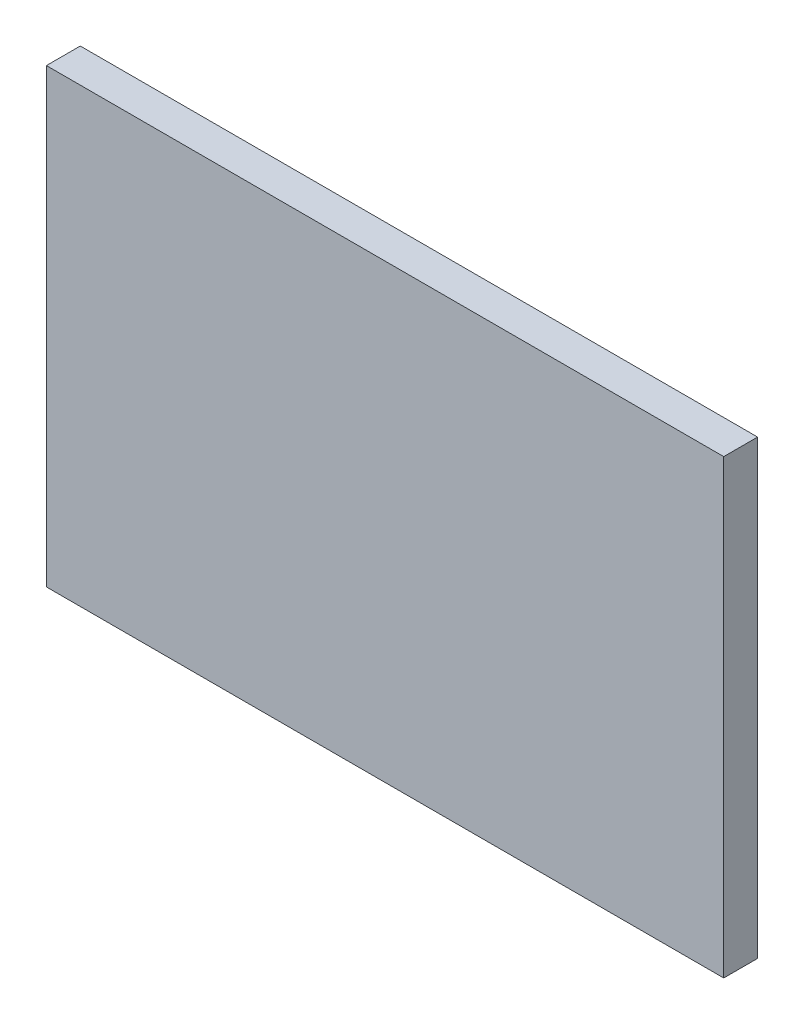
ISO-10303-21;
HEADER;
FILE_DESCRIPTION(('STEP AP214'),'2;1');
FILE_NAME('part.step','',(''),(''),'','','');
FILE_SCHEMA(('AUTOMOTIVE_DESIGN { 1 0 10303 214 1 1 1 1 }'));
ENDSEC;
DATA;
#1=APPLICATION_CONTEXT('core data for automotive mechanical design processes');
#2=APPLICATION_PROTOCOL_DEFINITION('international standard','automotive_design',2000,#1);
#3=PRODUCT_CONTEXT('',#1,'mechanical');
#4=PRODUCT('Part','Part','',(#3));
#5=PRODUCT_RELATED_PRODUCT_CATEGORY('part','',(#4));
#6=PRODUCT_DEFINITION_FORMATION('','',#4);
#7=PRODUCT_DEFINITION_CONTEXT('part definition',#1,'design');
#8=PRODUCT_DEFINITION('design','',#6,#7);
#9=PRODUCT_DEFINITION_SHAPE('','',#8);
#10=(LENGTH_UNIT() NAMED_UNIT(*) SI_UNIT(.MILLI.,.METRE.));
#11=(NAMED_UNIT(*) PLANE_ANGLE_UNIT() SI_UNIT($,.RADIAN.));
#12=(NAMED_UNIT(*) SI_UNIT($,.STERADIAN.) SOLID_ANGLE_UNIT());
#13=UNCERTAINTY_MEASURE_WITH_UNIT(LENGTH_MEASURE(1.E-05),#10,'distance_accuracy_value','');
#14=(GEOMETRIC_REPRESENTATION_CONTEXT(3) GLOBAL_UNCERTAINTY_ASSIGNED_CONTEXT((#13)) GLOBAL_UNIT_ASSIGNED_CONTEXT((#10,
#11,#12)) REPRESENTATION_CONTEXT('',''));
#15=CARTESIAN_POINT('',(0.,0.,0.));
#16=DIRECTION('',(0.,0.,1.));
#17=DIRECTION('',(1.,0.,0.));
#18=AXIS2_PLACEMENT_3D('',#15,#16,#17);
#19=CARTESIAN_POINT('',(-30.,40.,1.5));
#20=DIRECTION('',(1.,0.,0.));
#21=DIRECTION('',(0.,0.,-1.));
#22=AXIS2_PLACEMENT_3D('',#19,#20,#21);
#23=PLANE('',#22);
#24=DIRECTION('',(0.,0.,1.));
#25=VECTOR('',#24,1.);
#26=CARTESIAN_POINT('',(-30.,0.,1.5));
#27=LINE('',#26,#25);
#28=CARTESIAN_POINT('',(-30.,0.,-1.5));
#29=VERTEX_POINT('',#28);
#30=CARTESIAN_POINT('',(-30.,0.,1.5));
#31=VERTEX_POINT('',#30);
#32=EDGE_CURVE('E96',#29,#31,#27,.T.);
#33=ORIENTED_EDGE('',*,*,#32,.T.);
#34=DIRECTION('',(0.,-1.,0.));
#35=VECTOR('',#34,1.);
#36=CARTESIAN_POINT('',(-30.,40.,1.5));
#37=LINE('',#36,#35);
#38=CARTESIAN_POINT('',(-30.,40.,1.5));
#39=VERTEX_POINT('',#38);
#40=EDGE_CURVE('E11',#39,#31,#37,.T.);
#41=ORIENTED_EDGE('',*,*,#40,.F.);
#42=DIRECTION('',(0.,0.,1.));
#43=VECTOR('',#42,1.);
#44=CARTESIAN_POINT('',(-30.,40.,1.5));
#45=LINE('',#44,#43);
#46=CARTESIAN_POINT('',(-30.,40.,-1.5));
#47=VERTEX_POINT('',#46);
#48=EDGE_CURVE('E84',#47,#39,#45,.T.);
#49=ORIENTED_EDGE('',*,*,#48,.F.);
#50=DIRECTION('',(0.,-1.,0.));
#51=VECTOR('',#50,1.);
#52=CARTESIAN_POINT('',(-30.,40.,-1.5));
#53=LINE('',#52,#51);
#54=EDGE_CURVE('E92',#47,#29,#53,.T.);
#55=ORIENTED_EDGE('',*,*,#54,.T.);
#56=EDGE_LOOP('',(#33,#41,#49,#55));
#57=FACE_BOUND('',#56,.T.);
#58=ADVANCED_FACE('F33',(#57),#23,.F.);
#59=CARTESIAN_POINT('',(30.,40.,1.5));
#60=DIRECTION('',(0.,0.,-1.));
#61=DIRECTION('',(-1.,0.,0.));
#62=AXIS2_PLACEMENT_3D('',#59,#60,#61);
#63=PLANE('',#62);
#64=DIRECTION('',(1.,0.,0.));
#65=VECTOR('',#64,1.);
#66=CARTESIAN_POINT('',(30.,0.,1.5));
#67=LINE('',#66,#65);
#68=CARTESIAN_POINT('',(30.,0.,1.5));
#69=VERTEX_POINT('',#68);
#70=EDGE_CURVE('E88',#31,#69,#67,.T.);
#71=ORIENTED_EDGE('',*,*,#70,.T.);
#72=DIRECTION('',(0.,-1.,0.));
#73=VECTOR('',#72,1.);
#74=CARTESIAN_POINT('',(30.,40.,1.5));
#75=LINE('',#74,#73);
#76=CARTESIAN_POINT('',(30.,40.,1.5));
#77=VERTEX_POINT('',#76);
#78=EDGE_CURVE('E41',#77,#69,#75,.T.);
#79=ORIENTED_EDGE('',*,*,#78,.F.);
#80=DIRECTION('',(1.,0.,0.));
#81=VECTOR('',#80,1.);
#82=CARTESIAN_POINT('',(30.,40.,1.5));
#83=LINE('',#82,#81);
#84=EDGE_CURVE('E79',#39,#77,#83,.T.);
#85=ORIENTED_EDGE('',*,*,#84,.F.);
#86=ORIENTED_EDGE('',*,*,#40,.T.);
#87=EDGE_LOOP('',(#71,#79,#85,#86));
#88=FACE_BOUND('',#87,.T.);
#89=ADVANCED_FACE('F87',(#88),#63,.F.);
#90=CARTESIAN_POINT('',(30.,40.,1.5));
#91=DIRECTION('',(-1.,0.,0.));
#92=DIRECTION('',(0.,0.,1.));
#93=AXIS2_PLACEMENT_3D('',#90,#91,#92);
#94=PLANE('',#93);
#95=DIRECTION('',(0.,0.,-1.));
#96=VECTOR('',#95,1.);
#97=CARTESIAN_POINT('',(30.,0.,1.5));
#98=LINE('',#97,#96);
#99=CARTESIAN_POINT('',(30.,0.,-1.5));
#100=VERTEX_POINT('',#99);
#101=EDGE_CURVE('E66',#69,#100,#98,.T.);
#102=ORIENTED_EDGE('',*,*,#101,.T.);
#103=DIRECTION('',(0.,-1.,0.));
#104=VECTOR('',#103,1.);
#105=CARTESIAN_POINT('',(30.,40.,-1.5));
#106=LINE('',#105,#104);
#107=CARTESIAN_POINT('',(30.,40.,-1.5));
#108=VERTEX_POINT('',#107);
#109=EDGE_CURVE('E89',#108,#100,#106,.T.);
#110=ORIENTED_EDGE('',*,*,#109,.F.);
#111=DIRECTION('',(0.,0.,-1.));
#112=VECTOR('',#111,1.);
#113=CARTESIAN_POINT('',(30.,40.,1.5));
#114=LINE('',#113,#112);
#115=EDGE_CURVE('E82',#77,#108,#114,.T.);
#116=ORIENTED_EDGE('',*,*,#115,.F.);
#117=ORIENTED_EDGE('',*,*,#78,.T.);
#118=EDGE_LOOP('',(#102,#110,#116,#117));
#119=FACE_BOUND('',#118,.T.);
#120=ADVANCED_FACE('F90',(#119),#94,.F.);
#121=CARTESIAN_POINT('',(30.,40.,-1.5));
#122=DIRECTION('',(0.,0.,1.));
#123=DIRECTION('',(1.,0.,0.));
#124=AXIS2_PLACEMENT_3D('',#121,#122,#123);
#125=PLANE('',#124);
#126=DIRECTION('',(-1.,0.,0.));
#127=VECTOR('',#126,1.);
#128=CARTESIAN_POINT('',(30.,0.,-1.5));
#129=LINE('',#128,#127);
#130=EDGE_CURVE('E72',#100,#29,#129,.T.);
#131=ORIENTED_EDGE('',*,*,#130,.T.);
#132=ORIENTED_EDGE('',*,*,#54,.F.);
#133=DIRECTION('',(-1.,0.,0.));
#134=VECTOR('',#133,1.);
#135=CARTESIAN_POINT('',(30.,40.,-1.5));
#136=LINE('',#135,#134);
#137=EDGE_CURVE('E49',#108,#47,#136,.T.);
#138=ORIENTED_EDGE('',*,*,#137,.F.);
#139=ORIENTED_EDGE('',*,*,#109,.T.);
#140=EDGE_LOOP('',(#131,#132,#138,#139));
#141=FACE_BOUND('',#140,.T.);
#142=ADVANCED_FACE('F103',(#141),#125,.F.);
#143=CARTESIAN_POINT('',(0.,40.,0.));
#144=DIRECTION('',(0.,1.,0.));
#145=DIRECTION('',(0.,0.,1.));
#146=AXIS2_PLACEMENT_3D('',#143,#144,#145);
#147=PLANE('',#146);
#148=ORIENTED_EDGE('',*,*,#48,.T.);
#149=ORIENTED_EDGE('',*,*,#84,.T.);
#150=ORIENTED_EDGE('',*,*,#115,.T.);
#151=ORIENTED_EDGE('',*,*,#137,.T.);
#152=EDGE_LOOP('',(#148,#149,#150,#151));
#153=FACE_BOUND('',#152,.T.);
#154=ADVANCED_FACE('F80',(#153),#147,.T.);
#155=CARTESIAN_POINT('',(0.,0.,0.));
#156=DIRECTION('',(0.,1.,0.));
#157=DIRECTION('',(0.,0.,1.));
#158=AXIS2_PLACEMENT_3D('',#155,#156,#157);
#159=PLANE('',#158);
#160=ORIENTED_EDGE('',*,*,#32,.F.);
#161=ORIENTED_EDGE('',*,*,#130,.F.);
#162=ORIENTED_EDGE('',*,*,#101,.F.);
#163=ORIENTED_EDGE('',*,*,#70,.F.);
#164=EDGE_LOOP('',(#160,#161,#162,#163));
#165=FACE_BOUND('',#164,.T.);
#166=ADVANCED_FACE('F106',(#165),#159,.F.);
#167=CLOSED_SHELL('',(#58,#89,#120,#142,#154,#166));
#168=MANIFOLD_SOLID_BREP('B2',#167);
#169=ADVANCED_BREP_SHAPE_REPRESENTATION('',(#18,#168),#14);
#170=SHAPE_DEFINITION_REPRESENTATION(#9,#169);
ENDSEC;
END-ISO-10303-21;
